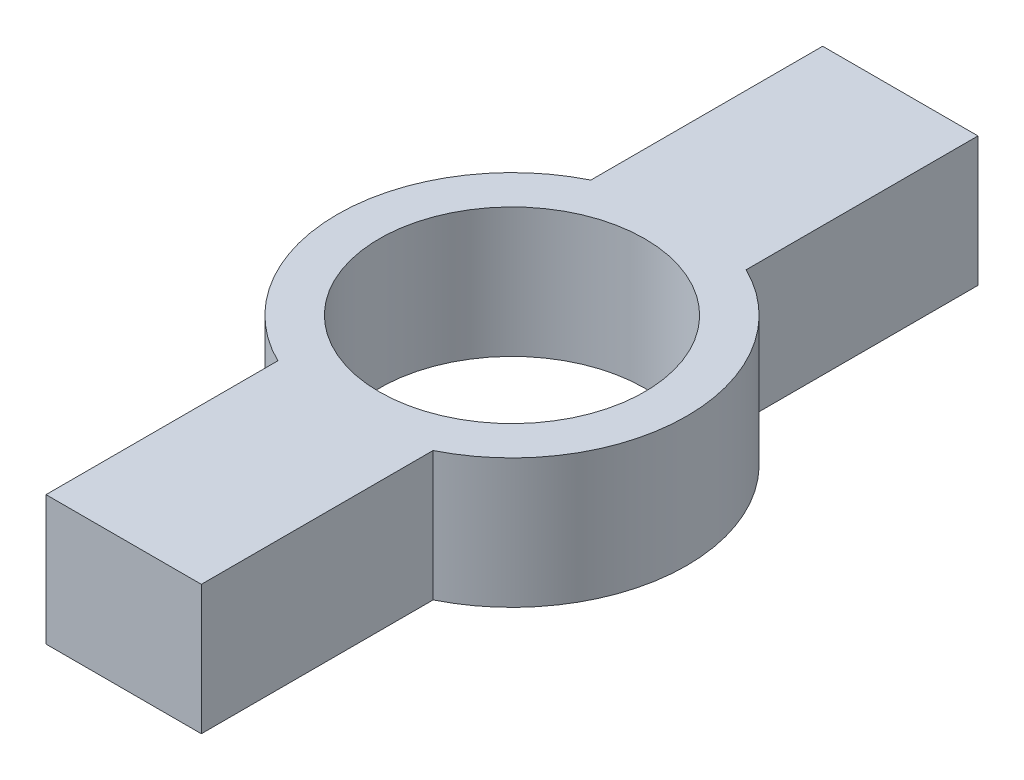
ISO-10303-21;
HEADER;
FILE_DESCRIPTION(('STEP AP214'),'2;1');
FILE_NAME('part.step','',(''),(''),'','','');
FILE_SCHEMA(('AUTOMOTIVE_DESIGN { 1 0 10303 214 1 1 1 1 }'));
ENDSEC;
DATA;
#1=APPLICATION_CONTEXT('core data for automotive mechanical design processes');
#2=APPLICATION_PROTOCOL_DEFINITION('international standard','automotive_design',2000,#1);
#3=PRODUCT_CONTEXT('',#1,'mechanical');
#4=PRODUCT('Part','Part','',(#3));
#5=PRODUCT_RELATED_PRODUCT_CATEGORY('part','',(#4));
#6=PRODUCT_DEFINITION_FORMATION('','',#4);
#7=PRODUCT_DEFINITION_CONTEXT('part definition',#1,'design');
#8=PRODUCT_DEFINITION('design','',#6,#7);
#9=PRODUCT_DEFINITION_SHAPE('','',#8);
#10=(LENGTH_UNIT() NAMED_UNIT(*) SI_UNIT(.MILLI.,.METRE.));
#11=(NAMED_UNIT(*) PLANE_ANGLE_UNIT() SI_UNIT($,.RADIAN.));
#12=(NAMED_UNIT(*) SI_UNIT($,.STERADIAN.) SOLID_ANGLE_UNIT());
#13=UNCERTAINTY_MEASURE_WITH_UNIT(LENGTH_MEASURE(1.E-05),#10,'distance_accuracy_value','');
#14=(GEOMETRIC_REPRESENTATION_CONTEXT(3) GLOBAL_UNCERTAINTY_ASSIGNED_CONTEXT((#13)) GLOBAL_UNIT_ASSIGNED_CONTEXT((#10,
#11,#12)) REPRESENTATION_CONTEXT('',''));
#15=CARTESIAN_POINT('',(0.,0.,0.));
#16=DIRECTION('',(0.,0.,1.));
#17=DIRECTION('',(1.,0.,0.));
#18=AXIS2_PLACEMENT_3D('',#15,#16,#17);
#19=CARTESIAN_POINT('',(0.,10.,0.));
#20=DIRECTION('',(0.,-1.,0.));
#21=DIRECTION('',(0.,0.,-1.));
#22=AXIS2_PLACEMENT_3D('',#19,#20,#21);
#23=CYLINDRICAL_SURFACE('',#22,13.5);
#24=CARTESIAN_POINT('',(0.,10.,0.));
#25=DIRECTION('',(0.,1.,0.));
#26=DIRECTION('',(0.,0.,1.));
#27=AXIS2_PLACEMENT_3D('',#24,#25,#26);
#28=CIRCLE('',#27,13.5);
#29=CARTESIAN_POINT('',(-6.,10.,-12.0933866224478));
#30=VERTEX_POINT('',#29);
#31=CARTESIAN_POINT('',(-5.99999999999999,10.,12.0933866224478));
#32=VERTEX_POINT('',#31);
#33=EDGE_CURVE('E50',#30,#32,#28,.T.);
#34=ORIENTED_EDGE('',*,*,#33,.F.);
#35=DIRECTION('',(0.,-1.,0.));
#36=VECTOR('',#35,1.);
#37=CARTESIAN_POINT('',(-6.,10.,-12.0933866224478));
#38=LINE('',#37,#36);
#39=CARTESIAN_POINT('',(-6.,0.,-12.0933866224478));
#40=VERTEX_POINT('',#39);
#41=EDGE_CURVE('E161',#30,#40,#38,.T.);
#42=ORIENTED_EDGE('',*,*,#41,.T.);
#43=CARTESIAN_POINT('',(0.,0.,0.));
#44=DIRECTION('',(0.,1.,0.));
#45=DIRECTION('',(0.,0.,1.));
#46=AXIS2_PLACEMENT_3D('',#43,#44,#45);
#47=CIRCLE('',#46,13.5);
#48=CARTESIAN_POINT('',(-5.99999999999999,0.,12.0933866224478));
#49=VERTEX_POINT('',#48);
#50=EDGE_CURVE('E163',#40,#49,#47,.T.);
#51=ORIENTED_EDGE('',*,*,#50,.T.);
#52=DIRECTION('',(0.,-1.,0.));
#53=VECTOR('',#52,1.);
#54=CARTESIAN_POINT('',(-5.99999999999999,10.,12.0933866224478));
#55=LINE('',#54,#53);
#56=EDGE_CURVE('E115',#49,#32,#55,.F.);
#57=ORIENTED_EDGE('',*,*,#56,.T.);
#58=EDGE_LOOP('',(#34,#42,#51,#57));
#59=FACE_BOUND('',#58,.T.);
#60=ADVANCED_FACE('F41',(#59),#23,.T.);
#61=CARTESIAN_POINT('',(6.00000000000001,10.,12.0933866224478));
#62=VERTEX_POINT('',#61);
#63=CARTESIAN_POINT('',(6.,10.,-12.0933866224478));
#64=VERTEX_POINT('',#63);
#65=EDGE_CURVE('E11',#62,#64,#28,.T.);
#66=ORIENTED_EDGE('',*,*,#65,.F.);
#67=DIRECTION('',(0.,-1.,0.));
#68=VECTOR('',#67,1.);
#69=CARTESIAN_POINT('',(6.00000000000001,10.,12.0933866224478));
#70=LINE('',#69,#68);
#71=CARTESIAN_POINT('',(6.00000000000001,0.,12.0933866224478));
#72=VERTEX_POINT('',#71);
#73=EDGE_CURVE('E157',#62,#72,#70,.T.);
#74=ORIENTED_EDGE('',*,*,#73,.T.);
#75=CARTESIAN_POINT('',(6.,0.,-12.0933866224478));
#76=VERTEX_POINT('',#75);
#77=EDGE_CURVE('E45',#72,#76,#47,.T.);
#78=ORIENTED_EDGE('',*,*,#77,.T.);
#79=DIRECTION('',(0.,-1.,0.));
#80=VECTOR('',#79,1.);
#81=CARTESIAN_POINT('',(6.,10.,-12.0933866224478));
#82=LINE('',#81,#80);
#83=EDGE_CURVE('E150',#76,#64,#82,.F.);
#84=ORIENTED_EDGE('',*,*,#83,.T.);
#85=EDGE_LOOP('',(#66,#74,#78,#84));
#86=FACE_BOUND('',#85,.T.);
#87=ADVANCED_FACE('F43',(#86),#23,.T.);
#88=CARTESIAN_POINT('',(0.,10.,0.));
#89=DIRECTION('',(0.,1.,0.));
#90=DIRECTION('',(0.,0.,1.));
#91=AXIS2_PLACEMENT_3D('',#88,#89,#90);
#92=PLANE('',#91);
#93=CARTESIAN_POINT('',(0.,10.,0.));
#94=DIRECTION('',(0.,1.,0.));
#95=DIRECTION('',(0.,0.,1.));
#96=AXIS2_PLACEMENT_3D('',#93,#94,#95);
#97=CIRCLE('',#96,10.25);
#98=CARTESIAN_POINT('',(0.,10.,10.25));
#99=VERTEX_POINT('',#98);
#100=EDGE_CURVE('E208',#99,#99,#97,.T.);
#101=ORIENTED_EDGE('',*,*,#100,.F.);
#102=EDGE_LOOP('',(#101));
#103=FACE_BOUND('',#102,.T.);
#104=ORIENTED_EDGE('',*,*,#65,.T.);
#105=DIRECTION('',(0.,0.,-1.));
#106=VECTOR('',#105,1.);
#107=CARTESIAN_POINT('',(6.,10.,-30.));
#108=LINE('',#107,#106);
#109=CARTESIAN_POINT('',(6.,10.,-30.));
#110=VERTEX_POINT('',#109);
#111=EDGE_CURVE('E145',#64,#110,#108,.T.);
#112=ORIENTED_EDGE('',*,*,#111,.T.);
#113=DIRECTION('',(-1.,0.,0.));
#114=VECTOR('',#113,1.);
#115=CARTESIAN_POINT('',(-6.,10.,-30.));
#116=LINE('',#115,#114);
#117=CARTESIAN_POINT('',(-6.,10.,-30.));
#118=VERTEX_POINT('',#117);
#119=EDGE_CURVE('E121',#110,#118,#116,.T.);
#120=ORIENTED_EDGE('',*,*,#119,.T.);
#121=DIRECTION('',(0.,0.,1.));
#122=VECTOR('',#121,1.);
#123=CARTESIAN_POINT('',(-6.,10.,-30.));
#124=LINE('',#123,#122);
#125=EDGE_CURVE('E57',#118,#30,#124,.T.);
#126=ORIENTED_EDGE('',*,*,#125,.T.);
#127=ORIENTED_EDGE('',*,*,#33,.T.);
#128=CARTESIAN_POINT('',(-5.99999999999999,10.,30.));
#129=VERTEX_POINT('',#128);
#130=EDGE_CURVE('E143',#32,#129,#124,.T.);
#131=ORIENTED_EDGE('',*,*,#130,.T.);
#132=DIRECTION('',(1.,0.,0.));
#133=VECTOR('',#132,1.);
#134=CARTESIAN_POINT('',(-5.99999999999999,10.,30.));
#135=LINE('',#134,#133);
#136=CARTESIAN_POINT('',(6.00000000000001,10.,30.));
#137=VERTEX_POINT('',#136);
#138=EDGE_CURVE('E127',#129,#137,#135,.T.);
#139=ORIENTED_EDGE('',*,*,#138,.T.);
#140=EDGE_CURVE('E63',#137,#62,#108,.T.);
#141=ORIENTED_EDGE('',*,*,#140,.T.);
#142=EDGE_LOOP('',(#104,#112,#120,#126,#127,#131,#139,#141));
#143=FACE_BOUND('',#142,.T.);
#144=ADVANCED_FACE('F168',(#103,#143),#92,.T.);
#145=CARTESIAN_POINT('',(0.,0.,0.));
#146=DIRECTION('',(0.,1.,0.));
#147=DIRECTION('',(0.,0.,1.));
#148=AXIS2_PLACEMENT_3D('',#145,#146,#147);
#149=PLANE('',#148);
#150=CARTESIAN_POINT('',(0.,0.,0.));
#151=DIRECTION('',(0.,1.,0.));
#152=DIRECTION('',(0.,0.,1.));
#153=AXIS2_PLACEMENT_3D('',#150,#151,#152);
#154=CIRCLE('',#153,10.25);
#155=CARTESIAN_POINT('',(0.,0.,10.25));
#156=VERTEX_POINT('',#155);
#157=EDGE_CURVE('E206',#156,#156,#154,.T.);
#158=ORIENTED_EDGE('',*,*,#157,.T.);
#159=EDGE_LOOP('',(#158));
#160=FACE_BOUND('',#159,.T.);
#161=ORIENTED_EDGE('',*,*,#77,.F.);
#162=DIRECTION('',(0.,0.,-1.));
#163=VECTOR('',#162,1.);
#164=CARTESIAN_POINT('',(6.,0.,-30.));
#165=LINE('',#164,#163);
#166=CARTESIAN_POINT('',(6.00000000000001,0.,30.));
#167=VERTEX_POINT('',#166);
#168=EDGE_CURVE('E134',#167,#72,#165,.T.);
#169=ORIENTED_EDGE('',*,*,#168,.F.);
#170=DIRECTION('',(1.,0.,0.));
#171=VECTOR('',#170,1.);
#172=CARTESIAN_POINT('',(-5.99999999999999,0.,30.));
#173=LINE('',#172,#171);
#174=CARTESIAN_POINT('',(-5.99999999999999,0.,30.));
#175=VERTEX_POINT('',#174);
#176=EDGE_CURVE('E126',#175,#167,#173,.T.);
#177=ORIENTED_EDGE('',*,*,#176,.F.);
#178=DIRECTION('',(0.,0.,1.));
#179=VECTOR('',#178,1.);
#180=CARTESIAN_POINT('',(-6.,0.,-30.));
#181=LINE('',#180,#179);
#182=EDGE_CURVE('E109',#49,#175,#181,.T.);
#183=ORIENTED_EDGE('',*,*,#182,.F.);
#184=ORIENTED_EDGE('',*,*,#50,.F.);
#185=CARTESIAN_POINT('',(-6.,0.,-30.));
#186=VERTEX_POINT('',#185);
#187=EDGE_CURVE('E120',#186,#40,#181,.T.);
#188=ORIENTED_EDGE('',*,*,#187,.F.);
#189=DIRECTION('',(-1.,0.,0.));
#190=VECTOR('',#189,1.);
#191=CARTESIAN_POINT('',(-6.,0.,-30.));
#192=LINE('',#191,#190);
#193=CARTESIAN_POINT('',(6.,0.,-30.));
#194=VERTEX_POINT('',#193);
#195=EDGE_CURVE('E129',#194,#186,#192,.T.);
#196=ORIENTED_EDGE('',*,*,#195,.F.);
#197=EDGE_CURVE('E135',#76,#194,#165,.T.);
#198=ORIENTED_EDGE('',*,*,#197,.F.);
#199=EDGE_LOOP('',(#161,#169,#177,#183,#184,#188,#196,#198));
#200=FACE_BOUND('',#199,.T.);
#201=ADVANCED_FACE('F133',(#160,#200),#149,.F.);
#202=CARTESIAN_POINT('',(-5.99999999999999,0.,30.));
#203=DIRECTION('',(0.,0.,1.));
#204=DIRECTION('',(1.,0.,0.));
#205=AXIS2_PLACEMENT_3D('',#202,#203,#204);
#206=PLANE('',#205);
#207=ORIENTED_EDGE('',*,*,#138,.F.);
#208=DIRECTION('',(0.,1.,0.));
#209=VECTOR('',#208,1.);
#210=CARTESIAN_POINT('',(-5.99999999999999,0.,30.));
#211=LINE('',#210,#209);
#212=EDGE_CURVE('E112',#175,#129,#211,.T.);
#213=ORIENTED_EDGE('',*,*,#212,.F.);
#214=ORIENTED_EDGE('',*,*,#176,.T.);
#215=DIRECTION('',(0.,1.,0.));
#216=VECTOR('',#215,1.);
#217=CARTESIAN_POINT('',(6.00000000000001,0.,30.));
#218=LINE('',#217,#216);
#219=EDGE_CURVE('E128',#167,#137,#218,.T.);
#220=ORIENTED_EDGE('',*,*,#219,.T.);
#221=EDGE_LOOP('',(#207,#213,#214,#220));
#222=FACE_BOUND('',#221,.T.);
#223=ADVANCED_FACE('F125',(#222),#206,.T.);
#224=CARTESIAN_POINT('',(6.,0.,-30.));
#225=DIRECTION('',(1.,0.,0.));
#226=DIRECTION('',(0.,0.,-1.));
#227=AXIS2_PLACEMENT_3D('',#224,#225,#226);
#228=PLANE('',#227);
#229=ORIENTED_EDGE('',*,*,#73,.F.);
#230=ORIENTED_EDGE('',*,*,#140,.F.);
#231=ORIENTED_EDGE('',*,*,#219,.F.);
#232=ORIENTED_EDGE('',*,*,#168,.T.);
#233=EDGE_LOOP('',(#229,#230,#231,#232));
#234=FACE_BOUND('',#233,.T.);
#235=ADVANCED_FACE('F197',(#234),#228,.T.);
#236=CARTESIAN_POINT('',(-6.,0.,-30.));
#237=DIRECTION('',(-1.,0.,0.));
#238=DIRECTION('',(0.,0.,1.));
#239=AXIS2_PLACEMENT_3D('',#236,#237,#238);
#240=PLANE('',#239);
#241=ORIENTED_EDGE('',*,*,#56,.F.);
#242=ORIENTED_EDGE('',*,*,#182,.T.);
#243=ORIENTED_EDGE('',*,*,#212,.T.);
#244=ORIENTED_EDGE('',*,*,#130,.F.);
#245=EDGE_LOOP('',(#241,#242,#243,#244));
#246=FACE_BOUND('',#245,.T.);
#247=ADVANCED_FACE('F111',(#246),#240,.T.);
#248=ORIENTED_EDGE('',*,*,#41,.F.);
#249=ORIENTED_EDGE('',*,*,#125,.F.);
#250=DIRECTION('',(0.,1.,0.));
#251=VECTOR('',#250,1.);
#252=CARTESIAN_POINT('',(-6.,0.,-30.));
#253=LINE('',#252,#251);
#254=EDGE_CURVE('E148',#186,#118,#253,.T.);
#255=ORIENTED_EDGE('',*,*,#254,.F.);
#256=ORIENTED_EDGE('',*,*,#187,.T.);
#257=EDGE_LOOP('',(#248,#249,#255,#256));
#258=FACE_BOUND('',#257,.T.);
#259=ADVANCED_FACE('F189',(#258),#240,.T.);
#260=ORIENTED_EDGE('',*,*,#83,.F.);
#261=ORIENTED_EDGE('',*,*,#197,.T.);
#262=DIRECTION('',(0.,1.,0.));
#263=VECTOR('',#262,1.);
#264=CARTESIAN_POINT('',(6.,0.,-30.));
#265=LINE('',#264,#263);
#266=EDGE_CURVE('E151',#194,#110,#265,.T.);
#267=ORIENTED_EDGE('',*,*,#266,.T.);
#268=ORIENTED_EDGE('',*,*,#111,.F.);
#269=EDGE_LOOP('',(#260,#261,#267,#268));
#270=FACE_BOUND('',#269,.T.);
#271=ADVANCED_FACE('F182',(#270),#228,.T.);
#272=CARTESIAN_POINT('',(-6.,0.,-30.));
#273=DIRECTION('',(0.,0.,-1.));
#274=DIRECTION('',(-1.,0.,0.));
#275=AXIS2_PLACEMENT_3D('',#272,#273,#274);
#276=PLANE('',#275);
#277=ORIENTED_EDGE('',*,*,#119,.F.);
#278=ORIENTED_EDGE('',*,*,#266,.F.);
#279=ORIENTED_EDGE('',*,*,#195,.T.);
#280=ORIENTED_EDGE('',*,*,#254,.T.);
#281=EDGE_LOOP('',(#277,#278,#279,#280));
#282=FACE_BOUND('',#281,.T.);
#283=ADVANCED_FACE('F186',(#282),#276,.T.);
#284=CARTESIAN_POINT('',(0.,0.,0.));
#285=DIRECTION('',(0.,1.,0.));
#286=DIRECTION('',(0.,0.,1.));
#287=AXIS2_PLACEMENT_3D('',#284,#285,#286);
#288=CYLINDRICAL_SURFACE('',#287,10.25);
#289=ORIENTED_EDGE('',*,*,#157,.F.);
#290=EDGE_LOOP('',(#289));
#291=FACE_BOUND('',#290,.T.);
#292=ORIENTED_EDGE('',*,*,#100,.T.);
#293=EDGE_LOOP('',(#292));
#294=FACE_BOUND('',#293,.T.);
#295=ADVANCED_FACE('F213',(#291,#294),#288,.F.);
#296=CLOSED_SHELL('',(#60,#87,#144,#201,#223,#235,#247,#259,#271,#283,#295));
#297=MANIFOLD_SOLID_BREP('B2',#296);
#298=ADVANCED_BREP_SHAPE_REPRESENTATION('',(#18,#297),#14);
#299=SHAPE_DEFINITION_REPRESENTATION(#9,#298);
ENDSEC;
END-ISO-10303-21;
